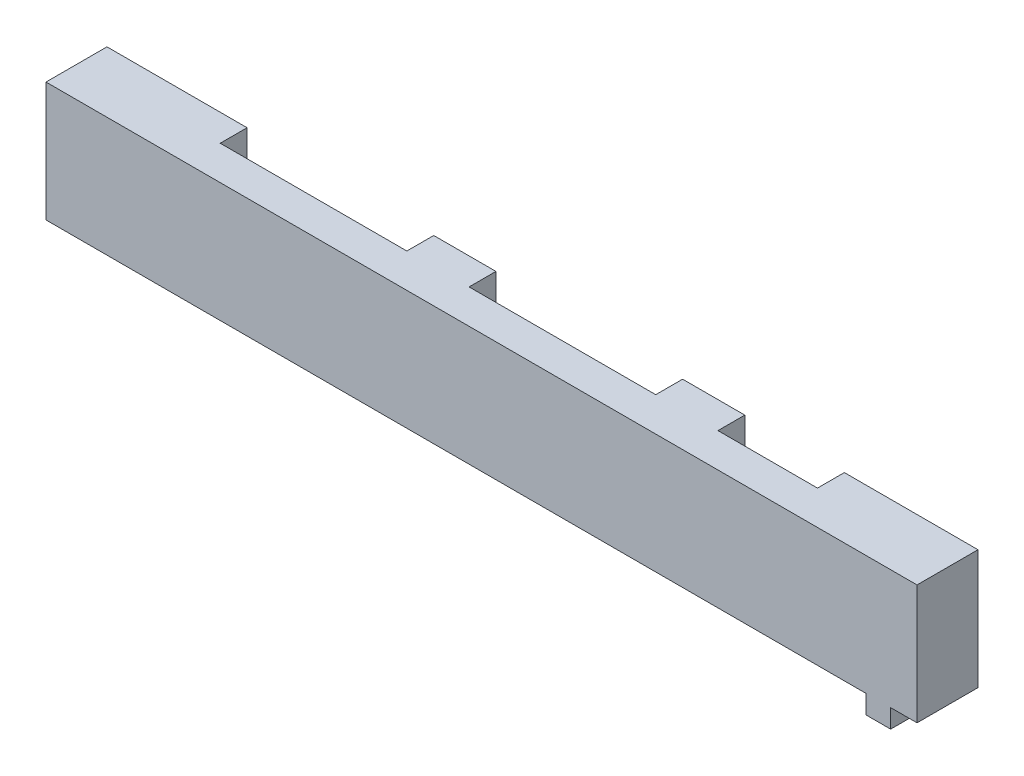
ISO-10303-21;
HEADER;
FILE_DESCRIPTION(('STEP AP214'),'2;1');
FILE_NAME('part.step','',(''),(''),'','','');
FILE_SCHEMA(('AUTOMOTIVE_DESIGN { 1 0 10303 214 1 1 1 1 }'));
ENDSEC;
DATA;
#1=APPLICATION_CONTEXT('core data for automotive mechanical design processes');
#2=APPLICATION_PROTOCOL_DEFINITION('international standard','automotive_design',2000,#1);
#3=PRODUCT_CONTEXT('',#1,'mechanical');
#4=PRODUCT('Part','Part','',(#3));
#5=PRODUCT_RELATED_PRODUCT_CATEGORY('part','',(#4));
#6=PRODUCT_DEFINITION_FORMATION('','',#4);
#7=PRODUCT_DEFINITION_CONTEXT('part definition',#1,'design');
#8=PRODUCT_DEFINITION('design','',#6,#7);
#9=PRODUCT_DEFINITION_SHAPE('','',#8);
#10=(LENGTH_UNIT() NAMED_UNIT(*) SI_UNIT(.MILLI.,.METRE.));
#11=(NAMED_UNIT(*) PLANE_ANGLE_UNIT() SI_UNIT($,.RADIAN.));
#12=(NAMED_UNIT(*) SI_UNIT($,.STERADIAN.) SOLID_ANGLE_UNIT());
#13=UNCERTAINTY_MEASURE_WITH_UNIT(LENGTH_MEASURE(1.E-05),#10,'distance_accuracy_value','');
#14=(GEOMETRIC_REPRESENTATION_CONTEXT(3) GLOBAL_UNCERTAINTY_ASSIGNED_CONTEXT((#13)) GLOBAL_UNIT_ASSIGNED_CONTEXT((#10,
#11,#12)) REPRESENTATION_CONTEXT('',''));
#15=CARTESIAN_POINT('',(0.,0.,0.));
#16=DIRECTION('',(0.,0.,1.));
#17=DIRECTION('',(1.,0.,0.));
#18=AXIS2_PLACEMENT_3D('',#15,#16,#17);
#19=CARTESIAN_POINT('',(70.,-8.35060805109748,1.92337398373984));
#20=DIRECTION('',(0.,1.,0.));
#21=DIRECTION('',(0.,0.,1.));
#22=AXIS2_PLACEMENT_3D('',#19,#20,#21);
#23=PLANE('',#22);
#24=DIRECTION('',(0.,0.,1.));
#25=VECTOR('',#24,1.);
#26=CARTESIAN_POINT('',(67.88,-8.35060805109748,1.92337398373984));
#27=LINE('',#26,#25);
#28=CARTESIAN_POINT('',(67.88,-8.35060805109748,-2.97662601626017));
#29=VERTEX_POINT('',#28);
#30=CARTESIAN_POINT('',(67.88,-8.35060805109748,1.92337398373984));
#31=VERTEX_POINT('',#30);
#32=EDGE_CURVE('E209',#29,#31,#27,.T.);
#33=ORIENTED_EDGE('',*,*,#32,.F.);
#34=DIRECTION('',(-1.,0.,0.));
#35=VECTOR('',#34,1.);
#36=CARTESIAN_POINT('',(70.,-8.35060805109748,-2.97662601626017));
#37=LINE('',#36,#35);
#38=CARTESIAN_POINT('',(70.,-8.35060805109748,-2.97662601626017));
#39=VERTEX_POINT('',#38);
#40=EDGE_CURVE('E354',#39,#29,#37,.T.);
#41=ORIENTED_EDGE('',*,*,#40,.F.);
#42=DIRECTION('',(0.,0.,-1.));
#43=VECTOR('',#42,1.);
#44=CARTESIAN_POINT('',(70.,-8.35060805109748,1.92337398373984));
#45=LINE('',#44,#43);
#46=CARTESIAN_POINT('',(70.,-8.35060805109748,1.92337398373984));
#47=VERTEX_POINT('',#46);
#48=EDGE_CURVE('E338',#47,#39,#45,.T.);
#49=ORIENTED_EDGE('',*,*,#48,.F.);
#50=DIRECTION('',(-1.,0.,0.));
#51=VECTOR('',#50,1.);
#52=CARTESIAN_POINT('',(70.,-8.35060805109748,1.92337398373984));
#53=LINE('',#52,#51);
#54=EDGE_CURVE('E70',#47,#31,#53,.T.);
#55=ORIENTED_EDGE('',*,*,#54,.T.);
#56=EDGE_LOOP('',(#33,#41,#49,#55));
#57=FACE_BOUND('',#56,.T.);
#58=ADVANCED_FACE('F45',(#57),#23,.F.);
#59=DIRECTION('',(0.,0.,-1.));
#60=VECTOR('',#59,1.);
#61=CARTESIAN_POINT('',(65.88,-8.35060805109748,1.92337398373984));
#62=LINE('',#61,#60);
#63=CARTESIAN_POINT('',(65.88,-8.35060805109748,1.92337398373984));
#64=VERTEX_POINT('',#63);
#65=CARTESIAN_POINT('',(65.88,-8.35060805109748,-2.97662601626017));
#66=VERTEX_POINT('',#65);
#67=EDGE_CURVE('E62',#64,#66,#62,.T.);
#68=ORIENTED_EDGE('',*,*,#67,.F.);
#69=CARTESIAN_POINT('',(0.,-8.35060805109748,1.92337398373984));
#70=VERTEX_POINT('',#69);
#71=EDGE_CURVE('E358',#64,#70,#53,.T.);
#72=ORIENTED_EDGE('',*,*,#71,.T.);
#73=DIRECTION('',(0.,0.,-1.));
#74=VECTOR('',#73,1.);
#75=CARTESIAN_POINT('',(0.,-8.35060805109748,1.92337398373984));
#76=LINE('',#75,#74);
#77=CARTESIAN_POINT('',(0.,-8.35060805109748,-2.97662601626017));
#78=VERTEX_POINT('',#77);
#79=EDGE_CURVE('E332',#70,#78,#76,.T.);
#80=ORIENTED_EDGE('',*,*,#79,.T.);
#81=CARTESIAN_POINT('',(11.26,-8.35060805109748,-2.97662601626044));
#82=VERTEX_POINT('',#81);
#83=EDGE_CURVE('E341',#82,#78,#37,.T.);
#84=ORIENTED_EDGE('',*,*,#83,.F.);
#85=DIRECTION('',(0.,0.,-1.));
#86=VECTOR('',#85,1.);
#87=CARTESIAN_POINT('',(11.26,-8.35060805109748,-2.97662601626044));
#88=LINE('',#87,#86);
#89=CARTESIAN_POINT('',(11.26,-8.35060805109748,-0.817309151388784));
#90=VERTEX_POINT('',#89);
#91=EDGE_CURVE('E311',#90,#82,#88,.T.);
#92=ORIENTED_EDGE('',*,*,#91,.F.);
#93=DIRECTION('',(-1.,0.,0.));
#94=VECTOR('',#93,1.);
#95=CARTESIAN_POINT('',(11.26,-8.35060805109748,-0.817309151388784));
#96=LINE('',#95,#94);
#97=CARTESIAN_POINT('',(26.26,-8.35060805109748,-0.817309151388645));
#98=VERTEX_POINT('',#97);
#99=EDGE_CURVE('E275',#98,#90,#96,.T.);
#100=ORIENTED_EDGE('',*,*,#99,.F.);
#101=DIRECTION('',(0.,0.,1.));
#102=VECTOR('',#101,1.);
#103=CARTESIAN_POINT('',(26.26,-8.35060805109748,-2.97662601626031));
#104=LINE('',#103,#102);
#105=CARTESIAN_POINT('',(26.26,-8.35060805109748,-2.97662601626031));
#106=VERTEX_POINT('',#105);
#107=EDGE_CURVE('E307',#106,#98,#104,.T.);
#108=ORIENTED_EDGE('',*,*,#107,.F.);
#109=CARTESIAN_POINT('',(31.26,-8.35060805109748,-2.9766260162603));
#110=VERTEX_POINT('',#109);
#111=EDGE_CURVE('E404',#110,#106,#37,.T.);
#112=ORIENTED_EDGE('',*,*,#111,.F.);
#113=DIRECTION('',(0.,0.,-1.));
#114=VECTOR('',#113,1.);
#115=CARTESIAN_POINT('',(31.26,-8.35060805109748,-2.9766260162603));
#116=LINE('',#115,#114);
#117=CARTESIAN_POINT('',(31.26,-8.35060805109748,-0.817309151388644));
#118=VERTEX_POINT('',#117);
#119=EDGE_CURVE('E280',#118,#110,#116,.T.);
#120=ORIENTED_EDGE('',*,*,#119,.F.);
#121=DIRECTION('',(-1.,0.,0.));
#122=VECTOR('',#121,1.);
#123=CARTESIAN_POINT('',(31.26,-8.35060805109748,-0.817309151388644));
#124=LINE('',#123,#122);
#125=CARTESIAN_POINT('',(46.26,-8.35060805109748,-0.817309151388505));
#126=VERTEX_POINT('',#125);
#127=EDGE_CURVE('E240',#126,#118,#124,.T.);
#128=ORIENTED_EDGE('',*,*,#127,.F.);
#129=DIRECTION('',(0.,0.,1.));
#130=VECTOR('',#129,1.);
#131=CARTESIAN_POINT('',(46.26,-8.35060805109748,-2.97662601626017));
#132=LINE('',#131,#130);
#133=CARTESIAN_POINT('',(46.26,-8.35060805109748,-2.97662601626017));
#134=VERTEX_POINT('',#133);
#135=EDGE_CURVE('E276',#134,#126,#132,.T.);
#136=ORIENTED_EDGE('',*,*,#135,.F.);
#137=CARTESIAN_POINT('',(51.26,-8.35060805109748,-2.97662601626017));
#138=VERTEX_POINT('',#137);
#139=EDGE_CURVE('E360',#138,#134,#37,.T.);
#140=ORIENTED_EDGE('',*,*,#139,.F.);
#141=DIRECTION('',(0.,0.,-1.));
#142=VECTOR('',#141,1.);
#143=CARTESIAN_POINT('',(51.26,-8.35060805109748,-2.97662601626017));
#144=LINE('',#143,#142);
#145=CARTESIAN_POINT('',(51.26,-8.35060805109748,-0.817309151388504));
#146=VERTEX_POINT('',#145);
#147=EDGE_CURVE('E226',#146,#138,#144,.T.);
#148=ORIENTED_EDGE('',*,*,#147,.F.);
#149=DIRECTION('',(-1.,0.,0.));
#150=VECTOR('',#149,1.);
#151=CARTESIAN_POINT('',(51.26,-8.35060805109748,-0.817309151388504));
#152=LINE('',#151,#150);
#153=CARTESIAN_POINT('',(59.26,-8.35060805109748,-0.817309151388784));
#154=VERTEX_POINT('',#153);
#155=EDGE_CURVE('E239',#154,#146,#152,.T.);
#156=ORIENTED_EDGE('',*,*,#155,.F.);
#157=DIRECTION('',(0.,0.,1.));
#158=VECTOR('',#157,1.);
#159=CARTESIAN_POINT('',(59.26,-8.35060805109748,-0.817309151388784));
#160=LINE('',#159,#158);
#161=CARTESIAN_POINT('',(59.26,-8.35060805109748,-2.97662601626017));
#162=VERTEX_POINT('',#161);
#163=EDGE_CURVE('E235',#162,#154,#160,.T.);
#164=ORIENTED_EDGE('',*,*,#163,.F.);
#165=EDGE_CURVE('E359',#66,#162,#37,.T.);
#166=ORIENTED_EDGE('',*,*,#165,.F.);
#167=EDGE_LOOP('',(#68,#72,#80,#84,#92,#100,#108,#112,#120,#128,#136,#140,#148,#156,#164,#166));
#168=FACE_BOUND('',#167,.T.);
#169=ADVANCED_FACE('F390',(#168),#23,.F.);
#170=CARTESIAN_POINT('',(70.,1.24939194890252,-2.97662601626016));
#171=DIRECTION('',(0.,0.,1.));
#172=DIRECTION('',(0.,-1.,0.));
#173=AXIS2_PLACEMENT_3D('',#170,#171,#172);
#174=PLANE('',#173);
#175=DIRECTION('',(-1.,0.,0.));
#176=VECTOR('',#175,1.);
#177=CARTESIAN_POINT('',(70.,1.24939194890252,-2.97662601626016));
#178=LINE('',#177,#176);
#179=CARTESIAN_POINT('',(51.26,1.24939194890252,-2.97662601626017));
#180=VERTEX_POINT('',#179);
#181=CARTESIAN_POINT('',(46.26,1.24939194890252,-2.97662601626017));
#182=VERTEX_POINT('',#181);
#183=EDGE_CURVE('E54',#180,#182,#178,.T.);
#184=ORIENTED_EDGE('',*,*,#183,.F.);
#185=DIRECTION('',(0.,-1.,0.));
#186=VECTOR('',#185,1.);
#187=CARTESIAN_POINT('',(51.26,1.24939194890252,-2.97662601626017));
#188=LINE('',#187,#186);
#189=EDGE_CURVE('E246',#180,#138,#188,.T.);
#190=ORIENTED_EDGE('',*,*,#189,.T.);
#191=ORIENTED_EDGE('',*,*,#139,.T.);
#192=DIRECTION('',(0.,-1.,0.));
#193=VECTOR('',#192,1.);
#194=CARTESIAN_POINT('',(46.26,1.24939194890252,-2.97662601626017));
#195=LINE('',#194,#193);
#196=EDGE_CURVE('E269',#182,#134,#195,.T.);
#197=ORIENTED_EDGE('',*,*,#196,.F.);
#198=EDGE_LOOP('',(#184,#190,#191,#197));
#199=FACE_BOUND('',#198,.T.);
#200=ADVANCED_FACE('F383',(#199),#174,.F.);
#201=ORIENTED_EDGE('',*,*,#40,.T.);
#202=DIRECTION('',(0.,1.,0.));
#203=VECTOR('',#202,1.);
#204=CARTESIAN_POINT('',(67.88,-9.85060805109748,-2.97662601626017));
#205=LINE('',#204,#203);
#206=CARTESIAN_POINT('',(67.88,-9.85060805109748,-2.97662601626017));
#207=VERTEX_POINT('',#206);
#208=EDGE_CURVE('E447',#207,#29,#205,.T.);
#209=ORIENTED_EDGE('',*,*,#208,.F.);
#210=DIRECTION('',(1.,0.,0.));
#211=VECTOR('',#210,1.);
#212=CARTESIAN_POINT('',(67.88,-9.85060805109748,-2.97662601626017));
#213=LINE('',#212,#211);
#214=CARTESIAN_POINT('',(65.88,-9.85060805109748,-2.97662601626017));
#215=VERTEX_POINT('',#214);
#216=EDGE_CURVE('E202',#215,#207,#213,.T.);
#217=ORIENTED_EDGE('',*,*,#216,.F.);
#218=DIRECTION('',(0.,1.,0.));
#219=VECTOR('',#218,1.);
#220=CARTESIAN_POINT('',(65.88,-9.85060805109748,-2.97662601626017));
#221=LINE('',#220,#219);
#222=EDGE_CURVE('E217',#215,#66,#221,.T.);
#223=ORIENTED_EDGE('',*,*,#222,.T.);
#224=ORIENTED_EDGE('',*,*,#165,.T.);
#225=DIRECTION('',(0.,-1.,0.));
#226=VECTOR('',#225,1.);
#227=CARTESIAN_POINT('',(59.26,1.24939194890252,-2.97662601626016));
#228=LINE('',#227,#226);
#229=CARTESIAN_POINT('',(59.26,1.24939194890252,-2.97662601626016));
#230=VERTEX_POINT('',#229);
#231=EDGE_CURVE('E234',#230,#162,#228,.T.);
#232=ORIENTED_EDGE('',*,*,#231,.F.);
#233=CARTESIAN_POINT('',(70.,1.24939194890252,-2.97662601626016));
#234=VERTEX_POINT('',#233);
#235=EDGE_CURVE('E11',#234,#230,#178,.T.);
#236=ORIENTED_EDGE('',*,*,#235,.F.);
#237=DIRECTION('',(0.,1.,0.));
#238=VECTOR('',#237,1.);
#239=CARTESIAN_POINT('',(70.,1.24939194890252,-2.97662601626016));
#240=LINE('',#239,#238);
#241=EDGE_CURVE('E327',#39,#234,#240,.T.);
#242=ORIENTED_EDGE('',*,*,#241,.F.);
#243=EDGE_LOOP('',(#201,#209,#217,#223,#224,#232,#236,#242));
#244=FACE_BOUND('',#243,.T.);
#245=ADVANCED_FACE('F429',(#244),#174,.F.);
#246=CARTESIAN_POINT('',(31.26,1.24939194890252,-2.9766260162603));
#247=VERTEX_POINT('',#246);
#248=CARTESIAN_POINT('',(26.26,1.24939194890252,-2.97662601626031));
#249=VERTEX_POINT('',#248);
#250=EDGE_CURVE('E369',#247,#249,#178,.T.);
#251=ORIENTED_EDGE('',*,*,#250,.F.);
#252=DIRECTION('',(0.,-1.,0.));
#253=VECTOR('',#252,1.);
#254=CARTESIAN_POINT('',(31.26,1.24939194890252,-2.9766260162603));
#255=LINE('',#254,#253);
#256=EDGE_CURVE('E265',#247,#110,#255,.T.);
#257=ORIENTED_EDGE('',*,*,#256,.T.);
#258=ORIENTED_EDGE('',*,*,#111,.T.);
#259=DIRECTION('',(0.,-1.,0.));
#260=VECTOR('',#259,1.);
#261=CARTESIAN_POINT('',(26.26,1.24939194890252,-2.97662601626031));
#262=LINE('',#261,#260);
#263=EDGE_CURVE('E215',#249,#106,#262,.T.);
#264=ORIENTED_EDGE('',*,*,#263,.F.);
#265=EDGE_LOOP('',(#251,#257,#258,#264));
#266=FACE_BOUND('',#265,.T.);
#267=ADVANCED_FACE('F402',(#266),#174,.F.);
#268=CARTESIAN_POINT('',(11.26,1.24939194890252,-2.97662601626044));
#269=VERTEX_POINT('',#268);
#270=CARTESIAN_POINT('',(0.,1.24939194890252,-2.97662601626016));
#271=VERTEX_POINT('',#270);
#272=EDGE_CURVE('E55',#269,#271,#178,.T.);
#273=ORIENTED_EDGE('',*,*,#272,.F.);
#274=DIRECTION('',(0.,-1.,0.));
#275=VECTOR('',#274,1.);
#276=CARTESIAN_POINT('',(11.26,1.24939194890252,-2.97662601626044));
#277=LINE('',#276,#275);
#278=EDGE_CURVE('E301',#269,#82,#277,.T.);
#279=ORIENTED_EDGE('',*,*,#278,.T.);
#280=ORIENTED_EDGE('',*,*,#83,.T.);
#281=DIRECTION('',(0.,1.,0.));
#282=VECTOR('',#281,1.);
#283=CARTESIAN_POINT('',(0.,1.24939194890252,-2.97662601626016));
#284=LINE('',#283,#282);
#285=EDGE_CURVE('E250',#78,#271,#284,.T.);
#286=ORIENTED_EDGE('',*,*,#285,.T.);
#287=EDGE_LOOP('',(#273,#279,#280,#286));
#288=FACE_BOUND('',#287,.T.);
#289=ADVANCED_FACE('F47',(#288),#174,.F.);
#290=CARTESIAN_POINT('',(70.,1.24939194890252,1.92337398373984));
#291=DIRECTION('',(0.,-1.,0.));
#292=DIRECTION('',(0.,0.,-1.));
#293=AXIS2_PLACEMENT_3D('',#290,#291,#292);
#294=PLANE('',#293);
#295=DIRECTION('',(-1.,0.,0.));
#296=VECTOR('',#295,1.);
#297=CARTESIAN_POINT('',(51.26,1.24939194890252,-0.817309151388504));
#298=LINE('',#297,#296);
#299=CARTESIAN_POINT('',(59.26,1.24939194890252,-0.817309151388784));
#300=VERTEX_POINT('',#299);
#301=CARTESIAN_POINT('',(51.26,1.24939194890252,-0.817309151388504));
#302=VERTEX_POINT('',#301);
#303=EDGE_CURVE('E225',#300,#302,#298,.T.);
#304=ORIENTED_EDGE('',*,*,#303,.T.);
#305=DIRECTION('',(0.,0.,-1.));
#306=VECTOR('',#305,1.);
#307=CARTESIAN_POINT('',(51.26,1.24939194890252,-2.97662601626017));
#308=LINE('',#307,#306);
#309=EDGE_CURVE('E230',#302,#180,#308,.T.);
#310=ORIENTED_EDGE('',*,*,#309,.T.);
#311=ORIENTED_EDGE('',*,*,#183,.T.);
#312=DIRECTION('',(0.,0.,1.));
#313=VECTOR('',#312,1.);
#314=CARTESIAN_POINT('',(46.26,1.24939194890252,-2.97662601626017));
#315=LINE('',#314,#313);
#316=CARTESIAN_POINT('',(46.26,1.24939194890252,-0.817309151388505));
#317=VERTEX_POINT('',#316);
#318=EDGE_CURVE('E264',#182,#317,#315,.T.);
#319=ORIENTED_EDGE('',*,*,#318,.T.);
#320=DIRECTION('',(-1.,0.,0.));
#321=VECTOR('',#320,1.);
#322=CARTESIAN_POINT('',(31.26,1.24939194890252,-0.817309151388644));
#323=LINE('',#322,#321);
#324=CARTESIAN_POINT('',(31.26,1.24939194890252,-0.817309151388644));
#325=VERTEX_POINT('',#324);
#326=EDGE_CURVE('E281',#317,#325,#323,.T.);
#327=ORIENTED_EDGE('',*,*,#326,.T.);
#328=DIRECTION('',(0.,0.,-1.));
#329=VECTOR('',#328,1.);
#330=CARTESIAN_POINT('',(31.26,1.24939194890252,-2.9766260162603));
#331=LINE('',#330,#329);
#332=EDGE_CURVE('E289',#325,#247,#331,.T.);
#333=ORIENTED_EDGE('',*,*,#332,.T.);
#334=ORIENTED_EDGE('',*,*,#250,.T.);
#335=DIRECTION('',(0.,0.,1.));
#336=VECTOR('',#335,1.);
#337=CARTESIAN_POINT('',(26.26,1.24939194890252,-2.97662601626031));
#338=LINE('',#337,#336);
#339=CARTESIAN_POINT('',(26.26,1.24939194890252,-0.817309151388645));
#340=VERTEX_POINT('',#339);
#341=EDGE_CURVE('E300',#249,#340,#338,.T.);
#342=ORIENTED_EDGE('',*,*,#341,.T.);
#343=DIRECTION('',(-1.,0.,0.));
#344=VECTOR('',#343,1.);
#345=CARTESIAN_POINT('',(11.26,1.24939194890252,-0.817309151388784));
#346=LINE('',#345,#344);
#347=CARTESIAN_POINT('',(11.26,1.24939194890252,-0.817309151388784));
#348=VERTEX_POINT('',#347);
#349=EDGE_CURVE('E312',#340,#348,#346,.T.);
#350=ORIENTED_EDGE('',*,*,#349,.T.);
#351=DIRECTION('',(0.,0.,-1.));
#352=VECTOR('',#351,1.);
#353=CARTESIAN_POINT('',(11.26,1.24939194890252,-2.97662601626044));
#354=LINE('',#353,#352);
#355=EDGE_CURVE('E320',#348,#269,#354,.T.);
#356=ORIENTED_EDGE('',*,*,#355,.T.);
#357=ORIENTED_EDGE('',*,*,#272,.T.);
#358=DIRECTION('',(0.,0.,1.));
#359=VECTOR('',#358,1.);
#360=CARTESIAN_POINT('',(0.,1.24939194890252,1.92337398373984));
#361=LINE('',#360,#359);
#362=CARTESIAN_POINT('',(0.,1.24939194890252,1.92337398373984));
#363=VERTEX_POINT('',#362);
#364=EDGE_CURVE('E345',#271,#363,#361,.T.);
#365=ORIENTED_EDGE('',*,*,#364,.T.);
#366=DIRECTION('',(-1.,0.,0.));
#367=VECTOR('',#366,1.);
#368=CARTESIAN_POINT('',(70.,1.24939194890252,1.92337398373984));
#369=LINE('',#368,#367);
#370=CARTESIAN_POINT('',(70.,1.24939194890252,1.92337398373984));
#371=VERTEX_POINT('',#370);
#372=EDGE_CURVE('E362',#371,#363,#369,.T.);
#373=ORIENTED_EDGE('',*,*,#372,.F.);
#374=DIRECTION('',(0.,0.,1.));
#375=VECTOR('',#374,1.);
#376=CARTESIAN_POINT('',(70.,1.24939194890252,1.92337398373984));
#377=LINE('',#376,#375);
#378=EDGE_CURVE('E331',#234,#371,#377,.T.);
#379=ORIENTED_EDGE('',*,*,#378,.F.);
#380=ORIENTED_EDGE('',*,*,#235,.T.);
#381=DIRECTION('',(0.,0.,1.));
#382=VECTOR('',#381,1.);
#383=CARTESIAN_POINT('',(59.26,1.24939194890252,-0.817309151388784));
#384=LINE('',#383,#382);
#385=EDGE_CURVE('E221',#230,#300,#384,.T.);
#386=ORIENTED_EDGE('',*,*,#385,.T.);
#387=EDGE_LOOP('',(#304,#310,#311,#319,#327,#333,#334,#342,#350,#356,#357,#365,#373,#379,#380,#386));
#388=FACE_BOUND('',#387,.T.);
#389=ADVANCED_FACE('F379',(#388),#294,.F.);
#390=CARTESIAN_POINT('',(70.,1.24939194890252,1.92337398373984));
#391=DIRECTION('',(0.,0.,-1.));
#392=DIRECTION('',(0.,1.,0.));
#393=AXIS2_PLACEMENT_3D('',#390,#391,#392);
#394=PLANE('',#393);
#395=DIRECTION('',(0.,-1.,0.));
#396=VECTOR('',#395,1.);
#397=CARTESIAN_POINT('',(0.,1.24939194890252,1.92337398373984));
#398=LINE('',#397,#396);
#399=EDGE_CURVE('E348',#363,#70,#398,.T.);
#400=ORIENTED_EDGE('',*,*,#399,.T.);
#401=ORIENTED_EDGE('',*,*,#71,.F.);
#402=DIRECTION('',(0.,1.,0.));
#403=VECTOR('',#402,1.);
#404=CARTESIAN_POINT('',(65.88,-9.85060805109748,1.92337398373984));
#405=LINE('',#404,#403);
#406=CARTESIAN_POINT('',(65.88,-9.85060805109748,1.92337398373984));
#407=VERTEX_POINT('',#406);
#408=EDGE_CURVE('E192',#407,#64,#405,.T.);
#409=ORIENTED_EDGE('',*,*,#408,.F.);
#410=DIRECTION('',(-1.,0.,0.));
#411=VECTOR('',#410,1.);
#412=CARTESIAN_POINT('',(67.88,-9.85060805109748,1.92337398373984));
#413=LINE('',#412,#411);
#414=CARTESIAN_POINT('',(67.88,-9.85060805109748,1.92337398373984));
#415=VERTEX_POINT('',#414);
#416=EDGE_CURVE('E184',#415,#407,#413,.T.);
#417=ORIENTED_EDGE('',*,*,#416,.F.);
#418=DIRECTION('',(0.,1.,0.));
#419=VECTOR('',#418,1.);
#420=CARTESIAN_POINT('',(67.88,-9.85060805109748,1.92337398373984));
#421=LINE('',#420,#419);
#422=EDGE_CURVE('E189',#415,#31,#421,.T.);
#423=ORIENTED_EDGE('',*,*,#422,.T.);
#424=ORIENTED_EDGE('',*,*,#54,.F.);
#425=DIRECTION('',(0.,-1.,0.));
#426=VECTOR('',#425,1.);
#427=CARTESIAN_POINT('',(70.,1.24939194890252,1.92337398373984));
#428=LINE('',#427,#426);
#429=EDGE_CURVE('E335',#371,#47,#428,.T.);
#430=ORIENTED_EDGE('',*,*,#429,.F.);
#431=ORIENTED_EDGE('',*,*,#372,.T.);
#432=EDGE_LOOP('',(#400,#401,#409,#417,#423,#424,#430,#431));
#433=FACE_BOUND('',#432,.T.);
#434=ADVANCED_FACE('F187',(#433),#394,.F.);
#435=CARTESIAN_POINT('',(70.,0.,0.));
#436=DIRECTION('',(1.,0.,0.));
#437=DIRECTION('',(0.,0.,-1.));
#438=AXIS2_PLACEMENT_3D('',#435,#436,#437);
#439=PLANE('',#438);
#440=ORIENTED_EDGE('',*,*,#241,.T.);
#441=ORIENTED_EDGE('',*,*,#378,.T.);
#442=ORIENTED_EDGE('',*,*,#429,.T.);
#443=ORIENTED_EDGE('',*,*,#48,.T.);
#444=EDGE_LOOP('',(#440,#441,#442,#443));
#445=FACE_BOUND('',#444,.T.);
#446=ADVANCED_FACE('F423',(#445),#439,.T.);
#447=CARTESIAN_POINT('',(0.,0.,0.));
#448=DIRECTION('',(1.,0.,0.));
#449=DIRECTION('',(0.,0.,-1.));
#450=AXIS2_PLACEMENT_3D('',#447,#448,#449);
#451=PLANE('',#450);
#452=ORIENTED_EDGE('',*,*,#285,.F.);
#453=ORIENTED_EDGE('',*,*,#79,.F.);
#454=ORIENTED_EDGE('',*,*,#399,.F.);
#455=ORIENTED_EDGE('',*,*,#364,.F.);
#456=EDGE_LOOP('',(#452,#453,#454,#455));
#457=FACE_BOUND('',#456,.T.);
#458=ADVANCED_FACE('F421',(#457),#451,.F.);
#459=CARTESIAN_POINT('',(11.26,1.24939194890252,-0.817309151388784));
#460=DIRECTION('',(0.,0.,1.));
#461=DIRECTION('',(1.,0.,0.));
#462=AXIS2_PLACEMENT_3D('',#459,#460,#461);
#463=PLANE('',#462);
#464=ORIENTED_EDGE('',*,*,#99,.T.);
#465=DIRECTION('',(0.,-1.,0.));
#466=VECTOR('',#465,1.);
#467=CARTESIAN_POINT('',(11.26,1.24939194890252,-0.817309151388784));
#468=LINE('',#467,#466);
#469=EDGE_CURVE('E296',#348,#90,#468,.T.);
#470=ORIENTED_EDGE('',*,*,#469,.F.);
#471=ORIENTED_EDGE('',*,*,#349,.F.);
#472=DIRECTION('',(0.,-1.,0.));
#473=VECTOR('',#472,1.);
#474=CARTESIAN_POINT('',(26.26,1.24939194890252,-0.817309151388645));
#475=LINE('',#474,#473);
#476=EDGE_CURVE('E211',#340,#98,#475,.T.);
#477=ORIENTED_EDGE('',*,*,#476,.T.);
#478=EDGE_LOOP('',(#464,#470,#471,#477));
#479=FACE_BOUND('',#478,.T.);
#480=ADVANCED_FACE('F412',(#479),#463,.F.);
#481=CARTESIAN_POINT('',(26.26,1.24939194890252,-2.97662601626031));
#482=DIRECTION('',(1.,0.,0.));
#483=DIRECTION('',(0.,0.,-1.));
#484=AXIS2_PLACEMENT_3D('',#481,#482,#483);
#485=PLANE('',#484);
#486=ORIENTED_EDGE('',*,*,#107,.T.);
#487=ORIENTED_EDGE('',*,*,#476,.F.);
#488=ORIENTED_EDGE('',*,*,#341,.F.);
#489=ORIENTED_EDGE('',*,*,#263,.T.);
#490=EDGE_LOOP('',(#486,#487,#488,#489));
#491=FACE_BOUND('',#490,.T.);
#492=ADVANCED_FACE('F407',(#491),#485,.F.);
#493=CARTESIAN_POINT('',(11.26,1.24939194890252,-2.97662601626044));
#494=DIRECTION('',(-1.,0.,0.));
#495=DIRECTION('',(0.,0.,1.));
#496=AXIS2_PLACEMENT_3D('',#493,#494,#495);
#497=PLANE('',#496);
#498=ORIENTED_EDGE('',*,*,#91,.T.);
#499=ORIENTED_EDGE('',*,*,#278,.F.);
#500=ORIENTED_EDGE('',*,*,#355,.F.);
#501=ORIENTED_EDGE('',*,*,#469,.T.);
#502=EDGE_LOOP('',(#498,#499,#500,#501));
#503=FACE_BOUND('',#502,.T.);
#504=ADVANCED_FACE('F416',(#503),#497,.F.);
#505=CARTESIAN_POINT('',(31.26,1.24939194890252,-0.817309151388644));
#506=DIRECTION('',(0.,0.,1.));
#507=DIRECTION('',(1.,0.,0.));
#508=AXIS2_PLACEMENT_3D('',#505,#506,#507);
#509=PLANE('',#508);
#510=ORIENTED_EDGE('',*,*,#127,.T.);
#511=DIRECTION('',(0.,-1.,0.));
#512=VECTOR('',#511,1.);
#513=CARTESIAN_POINT('',(31.26,1.24939194890252,-0.817309151388644));
#514=LINE('',#513,#512);
#515=EDGE_CURVE('E260',#325,#118,#514,.T.);
#516=ORIENTED_EDGE('',*,*,#515,.F.);
#517=ORIENTED_EDGE('',*,*,#326,.F.);
#518=DIRECTION('',(0.,-1.,0.));
#519=VECTOR('',#518,1.);
#520=CARTESIAN_POINT('',(46.26,1.24939194890252,-0.817309151388505));
#521=LINE('',#520,#519);
#522=EDGE_CURVE('E272',#317,#126,#521,.T.);
#523=ORIENTED_EDGE('',*,*,#522,.T.);
#524=EDGE_LOOP('',(#510,#516,#517,#523));
#525=FACE_BOUND('',#524,.T.);
#526=ADVANCED_FACE('F395',(#525),#509,.F.);
#527=CARTESIAN_POINT('',(46.26,1.24939194890252,-2.97662601626017));
#528=DIRECTION('',(1.,0.,0.));
#529=DIRECTION('',(0.,0.,-1.));
#530=AXIS2_PLACEMENT_3D('',#527,#528,#529);
#531=PLANE('',#530);
#532=ORIENTED_EDGE('',*,*,#135,.T.);
#533=ORIENTED_EDGE('',*,*,#522,.F.);
#534=ORIENTED_EDGE('',*,*,#318,.F.);
#535=ORIENTED_EDGE('',*,*,#196,.T.);
#536=EDGE_LOOP('',(#532,#533,#534,#535));
#537=FACE_BOUND('',#536,.T.);
#538=ADVANCED_FACE('F388',(#537),#531,.F.);
#539=CARTESIAN_POINT('',(31.26,1.24939194890252,-2.9766260162603));
#540=DIRECTION('',(-1.,0.,0.));
#541=DIRECTION('',(0.,0.,1.));
#542=AXIS2_PLACEMENT_3D('',#539,#540,#541);
#543=PLANE('',#542);
#544=ORIENTED_EDGE('',*,*,#119,.T.);
#545=ORIENTED_EDGE('',*,*,#256,.F.);
#546=ORIENTED_EDGE('',*,*,#332,.F.);
#547=ORIENTED_EDGE('',*,*,#515,.T.);
#548=EDGE_LOOP('',(#544,#545,#546,#547));
#549=FACE_BOUND('',#548,.T.);
#550=ADVANCED_FACE('F399',(#549),#543,.F.);
#551=CARTESIAN_POINT('',(51.26,1.24939194890252,-2.97662601626017));
#552=DIRECTION('',(-1.,0.,0.));
#553=DIRECTION('',(0.,0.,1.));
#554=AXIS2_PLACEMENT_3D('',#551,#552,#553);
#555=PLANE('',#554);
#556=ORIENTED_EDGE('',*,*,#147,.T.);
#557=ORIENTED_EDGE('',*,*,#189,.F.);
#558=ORIENTED_EDGE('',*,*,#309,.F.);
#559=DIRECTION('',(0.,-1.,0.));
#560=VECTOR('',#559,1.);
#561=CARTESIAN_POINT('',(51.26,1.24939194890252,-0.817309151388504));
#562=LINE('',#561,#560);
#563=EDGE_CURVE('E251',#302,#146,#562,.T.);
#564=ORIENTED_EDGE('',*,*,#563,.T.);
#565=EDGE_LOOP('',(#556,#557,#558,#564));
#566=FACE_BOUND('',#565,.T.);
#567=ADVANCED_FACE('F438',(#566),#555,.F.);
#568=CARTESIAN_POINT('',(51.26,1.24939194890252,-0.817309151388504));
#569=DIRECTION('',(0.,0.,1.));
#570=DIRECTION('',(1.,0.,0.));
#571=AXIS2_PLACEMENT_3D('',#568,#569,#570);
#572=PLANE('',#571);
#573=ORIENTED_EDGE('',*,*,#155,.T.);
#574=ORIENTED_EDGE('',*,*,#563,.F.);
#575=ORIENTED_EDGE('',*,*,#303,.F.);
#576=DIRECTION('',(0.,-1.,0.));
#577=VECTOR('',#576,1.);
#578=CARTESIAN_POINT('',(59.26,1.24939194890252,-0.817309151388784));
#579=LINE('',#578,#577);
#580=EDGE_CURVE('E254',#300,#154,#579,.T.);
#581=ORIENTED_EDGE('',*,*,#580,.T.);
#582=EDGE_LOOP('',(#573,#574,#575,#581));
#583=FACE_BOUND('',#582,.T.);
#584=ADVANCED_FACE('F436',(#583),#572,.F.);
#585=CARTESIAN_POINT('',(59.26,1.24939194890252,-0.817309151388784));
#586=DIRECTION('',(1.,0.,0.));
#587=DIRECTION('',(0.,0.,-1.));
#588=AXIS2_PLACEMENT_3D('',#585,#586,#587);
#589=PLANE('',#588);
#590=ORIENTED_EDGE('',*,*,#163,.T.);
#591=ORIENTED_EDGE('',*,*,#580,.F.);
#592=ORIENTED_EDGE('',*,*,#385,.F.);
#593=ORIENTED_EDGE('',*,*,#231,.T.);
#594=EDGE_LOOP('',(#590,#591,#592,#593));
#595=FACE_BOUND('',#594,.T.);
#596=ADVANCED_FACE('F432',(#595),#589,.F.);
#597=CARTESIAN_POINT('',(67.88,-9.85060805109748,1.92337398373984));
#598=DIRECTION('',(-1.,0.,0.));
#599=DIRECTION('',(0.,0.,1.));
#600=AXIS2_PLACEMENT_3D('',#597,#598,#599);
#601=PLANE('',#600);
#602=ORIENTED_EDGE('',*,*,#32,.T.);
#603=ORIENTED_EDGE('',*,*,#422,.F.);
#604=DIRECTION('',(0.,0.,1.));
#605=VECTOR('',#604,1.);
#606=CARTESIAN_POINT('',(67.88,-9.85060805109748,1.92337398373984));
#607=LINE('',#606,#605);
#608=EDGE_CURVE('E197',#207,#415,#607,.T.);
#609=ORIENTED_EDGE('',*,*,#608,.F.);
#610=ORIENTED_EDGE('',*,*,#208,.T.);
#611=EDGE_LOOP('',(#602,#603,#609,#610));
#612=FACE_BOUND('',#611,.T.);
#613=ADVANCED_FACE('F208',(#612),#601,.F.);
#614=CARTESIAN_POINT('',(65.88,-9.85060805109748,1.92337398373984));
#615=DIRECTION('',(1.,0.,0.));
#616=DIRECTION('',(0.,0.,-1.));
#617=AXIS2_PLACEMENT_3D('',#614,#615,#616);
#618=PLANE('',#617);
#619=ORIENTED_EDGE('',*,*,#67,.T.);
#620=ORIENTED_EDGE('',*,*,#222,.F.);
#621=DIRECTION('',(0.,0.,-1.));
#622=VECTOR('',#621,1.);
#623=CARTESIAN_POINT('',(65.88,-9.85060805109748,1.92337398373984));
#624=LINE('',#623,#622);
#625=EDGE_CURVE('E196',#407,#215,#624,.T.);
#626=ORIENTED_EDGE('',*,*,#625,.F.);
#627=ORIENTED_EDGE('',*,*,#408,.T.);
#628=EDGE_LOOP('',(#619,#620,#626,#627));
#629=FACE_BOUND('',#628,.T.);
#630=ADVANCED_FACE('F443',(#629),#618,.F.);
#631=CARTESIAN_POINT('',(0.,-9.85060805109748,0.));
#632=DIRECTION('',(0.,1.,0.));
#633=DIRECTION('',(0.,0.,1.));
#634=AXIS2_PLACEMENT_3D('',#631,#632,#633);
#635=PLANE('',#634);
#636=ORIENTED_EDGE('',*,*,#608,.T.);
#637=ORIENTED_EDGE('',*,*,#416,.T.);
#638=ORIENTED_EDGE('',*,*,#625,.T.);
#639=ORIENTED_EDGE('',*,*,#216,.T.);
#640=EDGE_LOOP('',(#636,#637,#638,#639));
#641=FACE_BOUND('',#640,.T.);
#642=ADVANCED_FACE('F200',(#641),#635,.F.);
#643=CLOSED_SHELL('',(#58,#169,#200,#245,#267,#289,#389,#434,#446,#458,#480,#492,#504,#526,#538,
#550,#567,#584,#596,#613,#630,#642));
#644=MANIFOLD_SOLID_BREP('B2',#643);
#645=ADVANCED_BREP_SHAPE_REPRESENTATION('',(#18,#644),#14);
#646=SHAPE_DEFINITION_REPRESENTATION(#9,#645);
ENDSEC;
END-ISO-10303-21;
